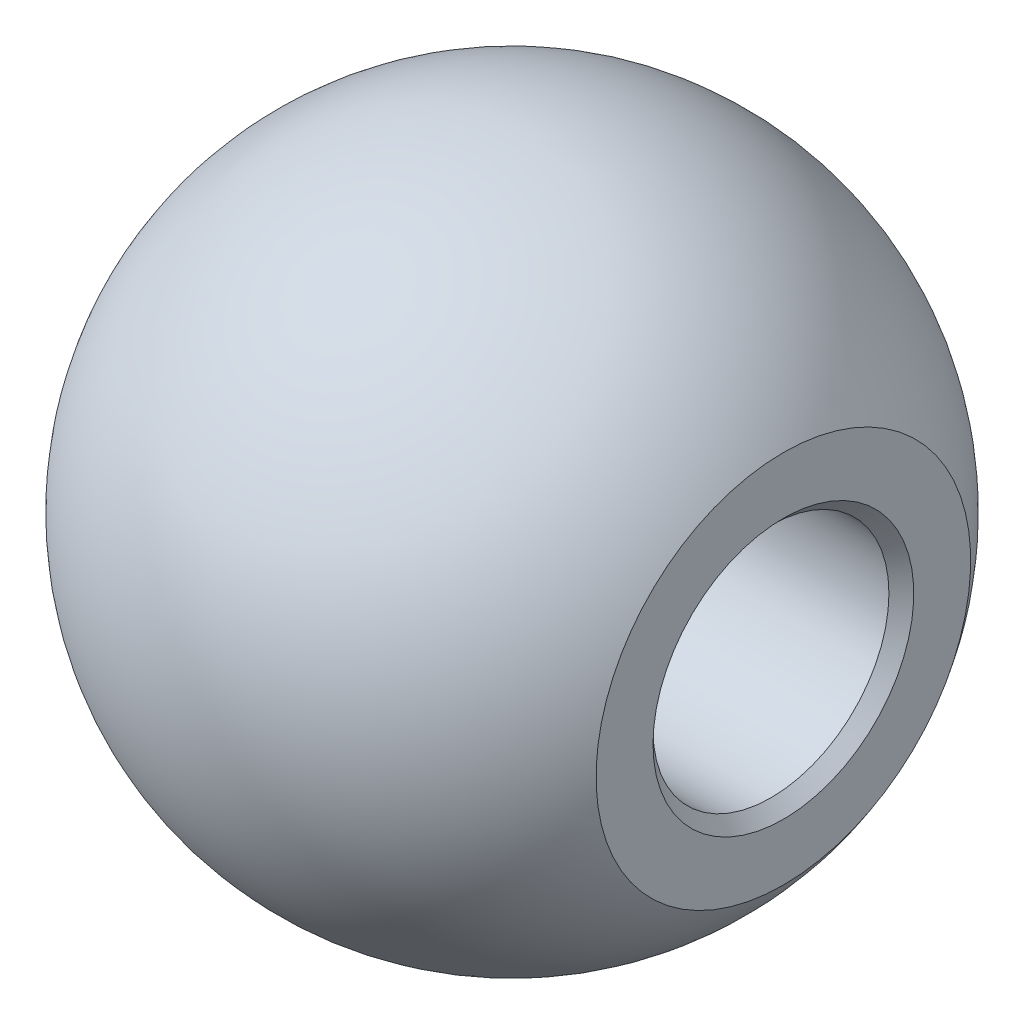
ISO-10303-21;
HEADER;
FILE_DESCRIPTION(('STEP AP214'),'2;1');
FILE_NAME('part.step','',(''),(''),'','','');
FILE_SCHEMA(('AUTOMOTIVE_DESIGN { 1 0 10303 214 1 1 1 1 }'));
ENDSEC;
DATA;
#1=APPLICATION_CONTEXT('core data for automotive mechanical design processes');
#2=APPLICATION_PROTOCOL_DEFINITION('international standard','automotive_design',2000,#1);
#3=PRODUCT_CONTEXT('',#1,'mechanical');
#4=PRODUCT('Part','Part','',(#3));
#5=PRODUCT_RELATED_PRODUCT_CATEGORY('part','',(#4));
#6=PRODUCT_DEFINITION_FORMATION('','',#4);
#7=PRODUCT_DEFINITION_CONTEXT('part definition',#1,'design');
#8=PRODUCT_DEFINITION('design','',#6,#7);
#9=PRODUCT_DEFINITION_SHAPE('','',#8);
#10=(LENGTH_UNIT() NAMED_UNIT(*) SI_UNIT(.MILLI.,.METRE.));
#11=(NAMED_UNIT(*) PLANE_ANGLE_UNIT() SI_UNIT($,.RADIAN.));
#12=(NAMED_UNIT(*) SI_UNIT($,.STERADIAN.) SOLID_ANGLE_UNIT());
#13=UNCERTAINTY_MEASURE_WITH_UNIT(LENGTH_MEASURE(1.E-05),#10,'distance_accuracy_value','');
#14=(GEOMETRIC_REPRESENTATION_CONTEXT(3) GLOBAL_UNCERTAINTY_ASSIGNED_CONTEXT((#13)) GLOBAL_UNIT_ASSIGNED_CONTEXT((#10,
#11,#12)) REPRESENTATION_CONTEXT('',''));
#15=CARTESIAN_POINT('',(0.,0.,0.));
#16=DIRECTION('',(0.,0.,1.));
#17=DIRECTION('',(1.,0.,0.));
#18=AXIS2_PLACEMENT_3D('',#15,#16,#17);
#19=CARTESIAN_POINT('',(0.,0.,0.));
#20=DIRECTION('',(-1.,0.,0.));
#21=DIRECTION('',(0.,0.,1.));
#22=AXIS2_PLACEMENT_3D('',#19,#20,#21);
#23=CYLINDRICAL_SURFACE('',#22,2.413);
#24=CARTESIAN_POINT('',(5.2959,0.,0.));
#25=DIRECTION('',(-1.,0.,0.));
#26=DIRECTION('',(0.,0.,1.));
#27=AXIS2_PLACEMENT_3D('',#24,#25,#26);
#28=CIRCLE('',#27,2.413);
#29=CARTESIAN_POINT('',(5.2959,0.,2.413));
#30=VERTEX_POINT('',#29);
#31=EDGE_CURVE('E10',#30,#30,#28,.F.);
#32=ORIENTED_EDGE('',*,*,#31,.T.);
#33=EDGE_LOOP('',(#32));
#34=FACE_BOUND('',#33,.T.);
#35=CARTESIAN_POINT('',(-5.2959,0.,0.));
#36=DIRECTION('',(-1.,0.,0.));
#37=DIRECTION('',(0.,0.,1.));
#38=AXIS2_PLACEMENT_3D('',#35,#36,#37);
#39=CIRCLE('',#38,2.413);
#40=CARTESIAN_POINT('',(-5.2959,0.,2.413));
#41=VERTEX_POINT('',#40);
#42=EDGE_CURVE('E52',#41,#41,#39,.F.);
#43=ORIENTED_EDGE('',*,*,#42,.F.);
#44=EDGE_LOOP('',(#43));
#45=FACE_BOUND('',#44,.T.);
#46=ADVANCED_FACE('F37',(#34,#45),#23,.F.);
#47=CARTESIAN_POINT('',(5.5499,2.413,0.));
#48=DIRECTION('',(-1.,0.,0.));
#49=DIRECTION('',(0.,0.,1.));
#50=AXIS2_PLACEMENT_3D('',#47,#48,#49);
#51=PLANE('',#50);
#52=CARTESIAN_POINT('',(5.5499,0.,0.));
#53=DIRECTION('',(-1.,0.,0.));
#54=DIRECTION('',(0.,0.,1.));
#55=AXIS2_PLACEMENT_3D('',#52,#53,#54);
#56=CIRCLE('',#55,2.667);
#57=CARTESIAN_POINT('',(5.5499,0.,2.667));
#58=VERTEX_POINT('',#57);
#59=EDGE_CURVE('E44',#58,#58,#56,.T.);
#60=ORIENTED_EDGE('',*,*,#59,.T.);
#61=EDGE_LOOP('',(#60));
#62=FACE_BOUND('',#61,.T.);
#63=CARTESIAN_POINT('',(5.5499,0.,0.));
#64=DIRECTION('',(-1.,0.,0.));
#65=DIRECTION('',(0.,0.,1.));
#66=AXIS2_PLACEMENT_3D('',#63,#64,#65);
#67=CIRCLE('',#66,3.8309397907041);
#68=CARTESIAN_POINT('',(5.5499,3.8309397907041,0.));
#69=VERTEX_POINT('',#68);
#70=EDGE_CURVE('E48',#69,#69,#67,.T.);
#71=ORIENTED_EDGE('',*,*,#70,.F.);
#72=EDGE_LOOP('',(#71));
#73=FACE_BOUND('',#72,.T.);
#74=ADVANCED_FACE('F68',(#62,#73),#51,.F.);
#75=CARTESIAN_POINT('',(0.,0.,0.));
#76=DIRECTION('',(-1.,0.,0.));
#77=DIRECTION('',(0.,1.,0.));
#78=AXIS2_PLACEMENT_3D('',#75,#76,#77);
#79=SPHERICAL_SURFACE('',#78,6.7437);
#80=CARTESIAN_POINT('',(-5.5499,0.,0.));
#81=DIRECTION('',(-1.,0.,0.));
#82=DIRECTION('',(0.,0.,1.));
#83=AXIS2_PLACEMENT_3D('',#80,#81,#82);
#84=CIRCLE('',#83,3.8309397907041);
#85=CARTESIAN_POINT('',(-5.5499,3.8309397907041,0.));
#86=VERTEX_POINT('',#85);
#87=EDGE_CURVE('E60',#86,#86,#84,.T.);
#88=CARTESIAN_POINT('',(5.5499,3.8309397907041,0.));
#89=CARTESIAN_POINT('',(5.47275635800619,3.94270758581667,0.));
#90=CARTESIAN_POINT('',(5.39222826981804,4.05213850969361,0.));
#91=CARTESIAN_POINT('',(5.22471561022084,4.26594188232623,0.));
#92=CARTESIAN_POINT('',(5.13773103881179,4.37031433108189,0.));
#93=CARTESIAN_POINT('',(4.95761782194057,4.57361602082191,0.));
#94=CARTESIAN_POINT('',(4.8644891764784,4.67254526180626,0.));
#95=CARTESIAN_POINT('',(4.67242895147228,4.86460061003431,0.));
#96=CARTESIAN_POINT('',(4.57349737192831,4.95772671727801,0.));
#97=CARTESIAN_POINT('',(4.37019190095427,5.13783572124541,0.));
#98=CARTESIAN_POINT('',(4.26581800952419,5.22481861796911,0.));
#99=CARTESIAN_POINT('',(4.05200884798757,5.39232389442358,0.));
#100=CARTESIAN_POINT('',(3.94257357788104,5.47284627415435,0.));
#101=CARTESIAN_POINT('',(3.71904093862403,5.62713668801631,0.));
#102=CARTESIAN_POINT('',(3.60494356947355,5.7009047221475,0.));
#103=CARTESIAN_POINT('',(3.37250305527703,5.84141728682265,0.));
#104=CARTESIAN_POINT('',(3.25415991023099,5.90816181736661,0.));
#105=CARTESIAN_POINT('',(3.01365965057782,6.03438383727262,0.));
#106=CARTESIAN_POINT('',(2.89150253597068,6.09386132663467,0.));
#107=CARTESIAN_POINT('',(2.64382006220428,6.20533224425174,0.));
#108=CARTESIAN_POINT('',(2.51829470304502,6.25732567250675,0.));
#109=CARTESIAN_POINT('',(2.26433375454288,6.35363875519149,0.));
#110=CARTESIAN_POINT('',(2.13589816520001,6.3979584096212,0.));
#111=CARTESIAN_POINT('',(1.87658538965847,6.47876223198589,0.));
#112=CARTESIAN_POINT('',(1.7457082034598,6.51524639992086,0.));
#113=CARTESIAN_POINT('',(1.48198977634088,6.58024612656285,0.));
#114=CARTESIAN_POINT('',(1.34914853542063,6.60876168526986,0.));
#115=CARTESIAN_POINT('',(1.08198670740964,6.65772014643928,0.));
#116=CARTESIAN_POINT('',(0.947666120318913,6.67816304890168,0.));
#117=CARTESIAN_POINT('',(0.678035706324532,6.71090160591451,0.));
#118=CARTESIAN_POINT('',(0.542725879420881,6.72319726046496,0.));
#119=CARTESIAN_POINT('',(0.271610701678154,6.7395964575077,0.));
#120=CARTESIAN_POINT('',(0.135805350839078,6.7437,0.));
#121=CARTESIAN_POINT('',(-0.135805350839075,6.7437,0.));
#122=CARTESIAN_POINT('',(-0.271610701678151,6.7395964575077,0.));
#123=CARTESIAN_POINT('',(-0.542725879420878,6.72319726046496,0.));
#124=CARTESIAN_POINT('',(-0.67803570632453,6.71090160591451,0.));
#125=CARTESIAN_POINT('',(-0.94766612031891,6.67816304890168,0.));
#126=CARTESIAN_POINT('',(-1.08198670740964,6.65772014643928,0.));
#127=CARTESIAN_POINT('',(-1.34914853542062,6.60876168526986,0.));
#128=CARTESIAN_POINT('',(-1.48198977634088,6.58024612656285,0.));
#129=CARTESIAN_POINT('',(-1.7457082034598,6.51524639992086,0.));
#130=CARTESIAN_POINT('',(-1.87658538965847,6.47876223198589,0.));
#131=CARTESIAN_POINT('',(-2.13589816520001,6.3979584096212,0.));
#132=CARTESIAN_POINT('',(-2.26433375454288,6.35363875519149,0.));
#133=CARTESIAN_POINT('',(-2.51829470304501,6.25732567250675,0.));
#134=CARTESIAN_POINT('',(-2.64382006220427,6.20533224425174,0.));
#135=CARTESIAN_POINT('',(-2.89150253597067,6.09386132663468,0.));
#136=CARTESIAN_POINT('',(-3.01365965057781,6.03438383727263,0.));
#137=CARTESIAN_POINT('',(-3.25415991023099,5.90816181736662,0.));
#138=CARTESIAN_POINT('',(-3.37250305527703,5.84141728682265,0.));
#139=CARTESIAN_POINT('',(-3.60494356947355,5.7009047221475,0.));
#140=CARTESIAN_POINT('',(-3.71904093862403,5.62713668801631,0.));
#141=CARTESIAN_POINT('',(-3.94257357788104,5.47284627415435,0.));
#142=CARTESIAN_POINT('',(-4.05200884798757,5.39232389442358,0.));
#143=CARTESIAN_POINT('',(-4.26581800952418,5.22481861796911,0.));
#144=CARTESIAN_POINT('',(-4.37019190095427,5.13783572124541,0.));
#145=CARTESIAN_POINT('',(-4.57349737192831,4.95772671727801,0.));
#146=CARTESIAN_POINT('',(-4.67242895147227,4.86460061003431,0.));
#147=CARTESIAN_POINT('',(-4.8644891764784,4.67254526180626,0.));
#148=CARTESIAN_POINT('',(-4.95761782194057,4.57361602082191,0.));
#149=CARTESIAN_POINT('',(-5.13773103881178,4.37031433108189,0.));
#150=CARTESIAN_POINT('',(-5.22471561022084,4.26594188232623,0.));
#151=CARTESIAN_POINT('',(-5.39222826981804,4.05213850969361,0.));
#152=CARTESIAN_POINT('',(-5.47275635800619,3.94270758581667,0.));
#153=CARTESIAN_POINT('',(-5.5499,3.8309397907041,0.));
#154=B_SPLINE_CURVE_WITH_KNOTS('',3,(#88,#89,#90,#91,#92,#93,#94,#95,#96,#97,#98,#99,#100,#101,
#102,#103,#104,#105,#106,#107,#108,#109,#110,#111,#112,#113,#114,#115,#116,#117,#118,#119,#120,
#121,#122,#123,#124,#125,#126,#127,#128,#129,#130,#131,#132,#133,#134,#135,#136,#137,#138,#139,
#140,#141,#142,#143,#144,#145,#146,#147,#148,#149,#150,#151,#152,#153),.UNSPECIFIED.,.F.,.F.,(4,
2,2,2,2,2,2,2,2,2,2,2,2,2,2,2,2,2,2,2,2,2,2,2,2,2,2,2,2,2,2,2,4),(0.,0.407354126170115,
0.814708252340229,1.22206237851034,1.62941650468046,2.03677063085057,2.44412475702069,
2.8514788831908,3.25883300936092,3.66618713553103,4.07354126170114,4.48089538787126,
4.88824951404137,5.29560364021149,5.7029577663816,6.11031189255172,6.51766601872183,
6.92502014489195,7.33237427106206,7.73972839723217,8.14708252340229,8.55443664957241,
8.96179077574252,9.36914490191263,9.77649902808275,10.1838531542529,10.591207280423,
10.9985614065931,11.4059155327632,11.8132696589333,12.2206237851034,12.6279779112736,
13.0353320374437),.UNSPECIFIED.);
#155=EDGE_CURVE('BSEAM66',#69,#86,#154,.T.);
#156=ORIENTED_EDGE('',*,*,#70,.T.);
#157=ORIENTED_EDGE('',*,*,#87,.F.);
#158=ORIENTED_EDGE('',*,*,#155,.T.);
#159=ORIENTED_EDGE('',*,*,#155,.F.);
#160=EDGE_LOOP('',(#156,#158,#157,#159));
#161=FACE_BOUND('',#160,.T.);
#162=ADVANCED_FACE('F66',(#161),#79,.T.);
#163=CARTESIAN_POINT('',(5.5499,0.,0.));
#164=DIRECTION('',(1.,0.,0.));
#165=DIRECTION('',(0.,0.,-1.));
#166=AXIS2_PLACEMENT_3D('',#163,#164,#165);
#167=CONICAL_SURFACE('',#166,2.667,0.785398163397445);
#168=ORIENTED_EDGE('',*,*,#31,.F.);
#169=EDGE_LOOP('',(#168));
#170=FACE_BOUND('',#169,.T.);
#171=ORIENTED_EDGE('',*,*,#59,.F.);
#172=EDGE_LOOP('',(#171));
#173=FACE_BOUND('',#172,.T.);
#174=ADVANCED_FACE('F39',(#170,#173),#167,.F.);
#175=CARTESIAN_POINT('',(-5.5499,2.413,0.));
#176=DIRECTION('',(1.,0.,0.));
#177=DIRECTION('',(0.,0.,1.));
#178=AXIS2_PLACEMENT_3D('',#175,#176,#177);
#179=PLANE('',#178);
#180=CARTESIAN_POINT('',(-5.5499,0.,0.));
#181=DIRECTION('',(-1.,0.,0.));
#182=DIRECTION('',(0.,0.,1.));
#183=AXIS2_PLACEMENT_3D('',#180,#181,#182);
#184=CIRCLE('',#183,2.667);
#185=CARTESIAN_POINT('',(-5.5499,0.,2.667));
#186=VERTEX_POINT('',#185);
#187=EDGE_CURVE('E57',#186,#186,#184,.T.);
#188=ORIENTED_EDGE('',*,*,#187,.F.);
#189=EDGE_LOOP('',(#188));
#190=FACE_BOUND('',#189,.T.);
#191=ORIENTED_EDGE('',*,*,#87,.T.);
#192=EDGE_LOOP('',(#191));
#193=FACE_BOUND('',#192,.T.);
#194=ADVANCED_FACE('F64',(#190,#193),#179,.F.);
#195=CARTESIAN_POINT('',(-5.5499,0.,0.));
#196=DIRECTION('',(-1.,0.,0.));
#197=DIRECTION('',(0.,0.,-1.));
#198=AXIS2_PLACEMENT_3D('',#195,#196,#197);
#199=CONICAL_SURFACE('',#198,2.667,0.785398163397445);
#200=ORIENTED_EDGE('',*,*,#42,.T.);
#201=EDGE_LOOP('',(#200));
#202=FACE_BOUND('',#201,.T.);
#203=ORIENTED_EDGE('',*,*,#187,.T.);
#204=EDGE_LOOP('',(#203));
#205=FACE_BOUND('',#204,.T.);
#206=ADVANCED_FACE('F86',(#202,#205),#199,.F.);
#207=CLOSED_SHELL('',(#46,#74,#162,#174,#194,#206));
#208=MANIFOLD_SOLID_BREP('B2',#207);
#209=ADVANCED_BREP_SHAPE_REPRESENTATION('',(#18,#208),#14);
#210=SHAPE_DEFINITION_REPRESENTATION(#9,#209);
ENDSEC;
END-ISO-10303-21;
